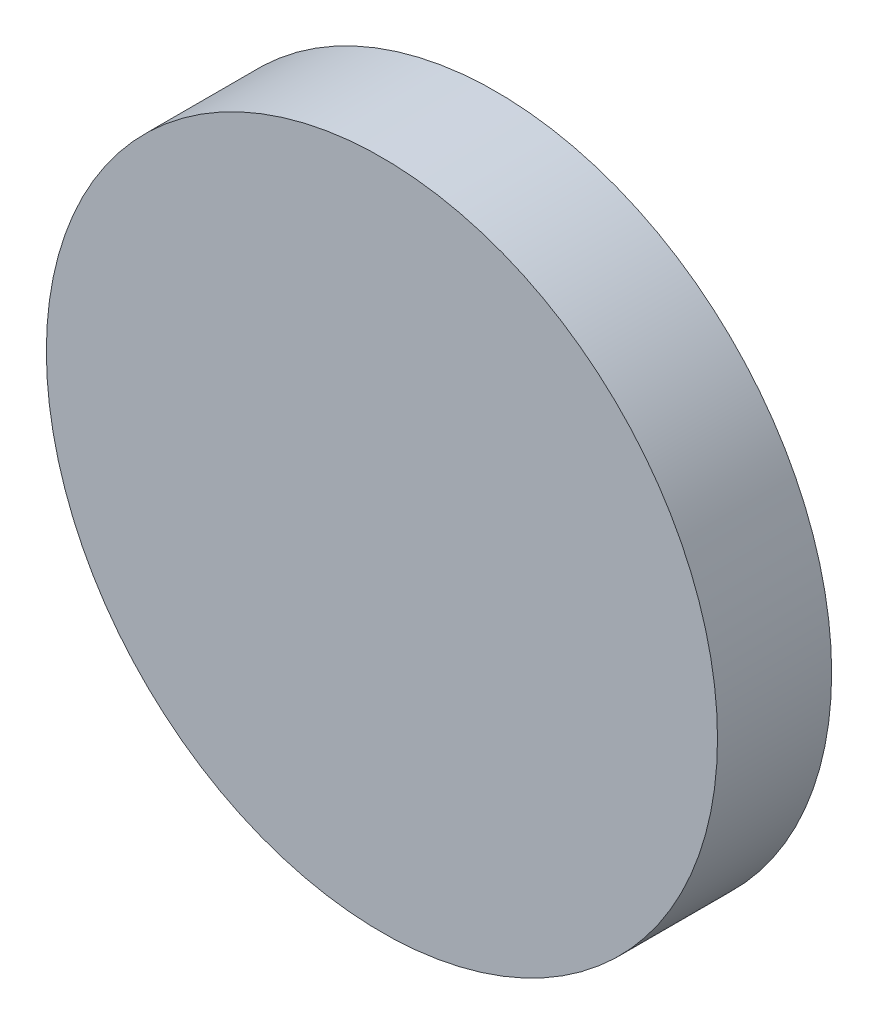
ISO-10303-21;
HEADER;
FILE_DESCRIPTION(('STEP AP214'),'2;1');
FILE_NAME('part.step','',(''),(''),'','','');
FILE_SCHEMA(('AUTOMOTIVE_DESIGN { 1 0 10303 214 1 1 1 1 }'));
ENDSEC;
DATA;
#1=APPLICATION_CONTEXT('core data for automotive mechanical design processes');
#2=APPLICATION_PROTOCOL_DEFINITION('international standard','automotive_design',2000,#1);
#3=PRODUCT_CONTEXT('',#1,'mechanical');
#4=PRODUCT('Part','Part','',(#3));
#5=PRODUCT_RELATED_PRODUCT_CATEGORY('part','',(#4));
#6=PRODUCT_DEFINITION_FORMATION('','',#4);
#7=PRODUCT_DEFINITION_CONTEXT('part definition',#1,'design');
#8=PRODUCT_DEFINITION('design','',#6,#7);
#9=PRODUCT_DEFINITION_SHAPE('','',#8);
#10=(LENGTH_UNIT() NAMED_UNIT(*) SI_UNIT(.MILLI.,.METRE.));
#11=(NAMED_UNIT(*) PLANE_ANGLE_UNIT() SI_UNIT($,.RADIAN.));
#12=(NAMED_UNIT(*) SI_UNIT($,.STERADIAN.) SOLID_ANGLE_UNIT());
#13=UNCERTAINTY_MEASURE_WITH_UNIT(LENGTH_MEASURE(1.E-05),#10,'distance_accuracy_value','');
#14=(GEOMETRIC_REPRESENTATION_CONTEXT(3) GLOBAL_UNCERTAINTY_ASSIGNED_CONTEXT((#13)) GLOBAL_UNIT_ASSIGNED_CONTEXT((#10,
#11,#12)) REPRESENTATION_CONTEXT('',''));
#15=CARTESIAN_POINT('',(0.,0.,0.));
#16=DIRECTION('',(0.,0.,1.));
#17=DIRECTION('',(1.,0.,0.));
#18=AXIS2_PLACEMENT_3D('',#15,#16,#17);
#19=CARTESIAN_POINT('',(0.,100.,69.5));
#20=DIRECTION('',(0.,0.,-1.));
#21=DIRECTION('',(-1.,0.,0.));
#22=AXIS2_PLACEMENT_3D('',#19,#20,#21);
#23=CYLINDRICAL_SURFACE('',#22,14.7);
#24=CARTESIAN_POINT('',(0.,100.,69.5));
#25=DIRECTION('',(0.,0.,1.));
#26=DIRECTION('',(1.,0.,0.));
#27=AXIS2_PLACEMENT_3D('',#24,#25,#26);
#28=CIRCLE('',#27,14.7);
#29=CARTESIAN_POINT('',(14.7,100.,69.5));
#30=VERTEX_POINT('',#29);
#31=EDGE_CURVE('E10',#30,#30,#28,.T.);
#32=ORIENTED_EDGE('',*,*,#31,.F.);
#33=EDGE_LOOP('',(#32));
#34=FACE_BOUND('',#33,.T.);
#35=CARTESIAN_POINT('',(0.,100.,64.5));
#36=DIRECTION('',(0.,0.,1.));
#37=DIRECTION('',(1.,0.,0.));
#38=AXIS2_PLACEMENT_3D('',#35,#36,#37);
#39=CIRCLE('',#38,14.7);
#40=CARTESIAN_POINT('',(14.7,100.,64.5));
#41=VERTEX_POINT('',#40);
#42=EDGE_CURVE('E44',#41,#41,#39,.T.);
#43=ORIENTED_EDGE('',*,*,#42,.T.);
#44=EDGE_LOOP('',(#43));
#45=FACE_BOUND('',#44,.T.);
#46=ADVANCED_FACE('F41',(#34,#45),#23,.T.);
#47=CARTESIAN_POINT('',(0.,100.,69.5));
#48=DIRECTION('',(0.,0.,1.));
#49=DIRECTION('',(1.,0.,0.));
#50=AXIS2_PLACEMENT_3D('',#47,#48,#49);
#51=PLANE('',#50);
#52=ORIENTED_EDGE('',*,*,#31,.T.);
#53=EDGE_LOOP('',(#52));
#54=FACE_BOUND('',#53,.T.);
#55=ADVANCED_FACE('F56',(#54),#51,.T.);
#56=CARTESIAN_POINT('',(0.,100.,64.5));
#57=DIRECTION('',(0.,0.,1.));
#58=DIRECTION('',(1.,0.,0.));
#59=AXIS2_PLACEMENT_3D('',#56,#57,#58);
#60=PLANE('',#59);
#61=ORIENTED_EDGE('',*,*,#42,.F.);
#62=EDGE_LOOP('',(#61));
#63=FACE_BOUND('',#62,.T.);
#64=ADVANCED_FACE('F54',(#63),#60,.F.);
#65=CLOSED_SHELL('',(#46,#55,#64));
#66=MANIFOLD_SOLID_BREP('B2',#65);
#67=ADVANCED_BREP_SHAPE_REPRESENTATION('',(#18,#66),#14);
#68=SHAPE_DEFINITION_REPRESENTATION(#9,#67);
ENDSEC;
END-ISO-10303-21;
